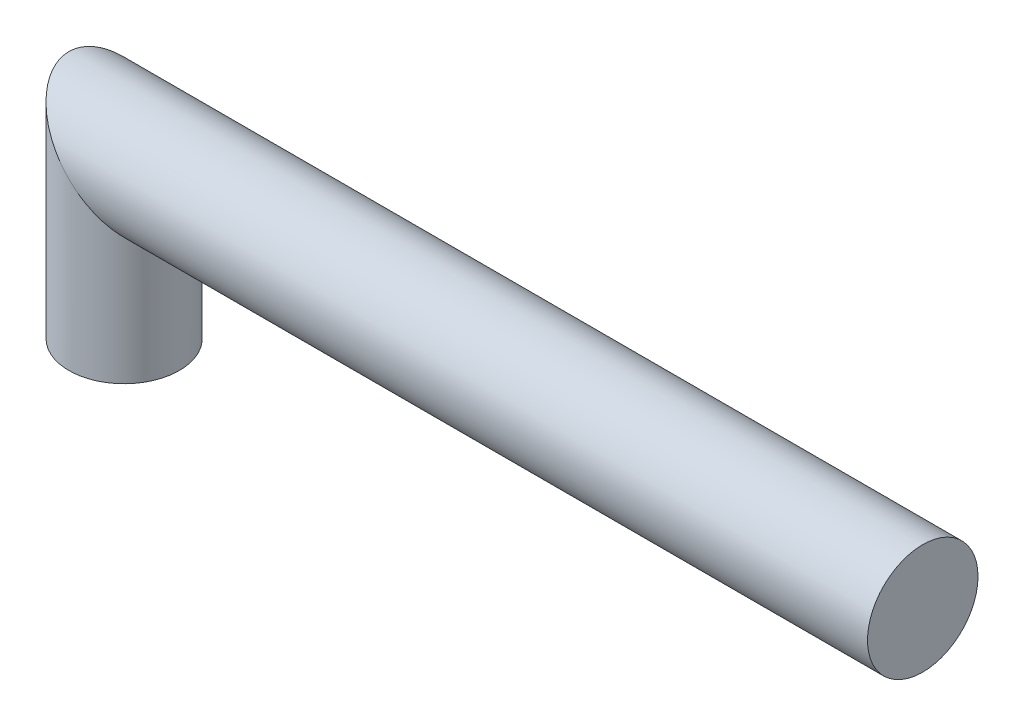
ISO-10303-21;
HEADER;
FILE_DESCRIPTION(('STEP AP214'),'2;1');
FILE_NAME('part.step','',(''),(''),'','','');
FILE_SCHEMA(('AUTOMOTIVE_DESIGN { 1 0 10303 214 1 1 1 1 }'));
ENDSEC;
DATA;
#1=APPLICATION_CONTEXT('core data for automotive mechanical design processes');
#2=APPLICATION_PROTOCOL_DEFINITION('international standard','automotive_design',2000,#1);
#3=PRODUCT_CONTEXT('',#1,'mechanical');
#4=PRODUCT('Part','Part','',(#3));
#5=PRODUCT_RELATED_PRODUCT_CATEGORY('part','',(#4));
#6=PRODUCT_DEFINITION_FORMATION('','',#4);
#7=PRODUCT_DEFINITION_CONTEXT('part definition',#1,'design');
#8=PRODUCT_DEFINITION('design','',#6,#7);
#9=PRODUCT_DEFINITION_SHAPE('','',#8);
#10=(LENGTH_UNIT() NAMED_UNIT(*) SI_UNIT(.MILLI.,.METRE.));
#11=(NAMED_UNIT(*) PLANE_ANGLE_UNIT() SI_UNIT($,.RADIAN.));
#12=(NAMED_UNIT(*) SI_UNIT($,.STERADIAN.) SOLID_ANGLE_UNIT());
#13=UNCERTAINTY_MEASURE_WITH_UNIT(LENGTH_MEASURE(1.E-05),#10,'distance_accuracy_value','');
#14=(GEOMETRIC_REPRESENTATION_CONTEXT(3) GLOBAL_UNCERTAINTY_ASSIGNED_CONTEXT((#13)) GLOBAL_UNIT_ASSIGNED_CONTEXT((#10,
#11,#12)) REPRESENTATION_CONTEXT('',''));
#15=CARTESIAN_POINT('',(0.,0.,0.));
#16=DIRECTION('',(0.,0.,1.));
#17=DIRECTION('',(1.,0.,0.));
#18=AXIS2_PLACEMENT_3D('',#15,#16,#17);
#19=CARTESIAN_POINT('',(-42.73,-30.,0.));
#20=DIRECTION('',(0.,1.,0.));
#21=DIRECTION('',(0.,0.,-1.));
#22=AXIS2_PLACEMENT_3D('',#19,#20,#21);
#23=PLANE('',#22);
#24=CARTESIAN_POINT('',(-42.73,-30.,0.));
#25=DIRECTION('',(0.,1.,0.));
#26=DIRECTION('',(0.,0.,-1.));
#27=AXIS2_PLACEMENT_3D('',#24,#25,#26);
#28=CIRCLE('',#27,10.);
#29=CARTESIAN_POINT('',(-42.73,-30.,-10.));
#30=VERTEX_POINT('',#29);
#31=EDGE_CURVE('E38',#30,#30,#28,.T.);
#32=ORIENTED_EDGE('',*,*,#31,.F.);
#33=EDGE_LOOP('',(#32));
#34=FACE_BOUND('',#33,.T.);
#35=ADVANCED_FACE('F35',(#34),#23,.F.);
#36=CARTESIAN_POINT('',(101.83,0.,0.));
#37=DIRECTION('',(1.,0.,0.));
#38=DIRECTION('',(0.,0.,-1.));
#39=AXIS2_PLACEMENT_3D('',#36,#37,#38);
#40=PLANE('',#39);
#41=CARTESIAN_POINT('',(101.83,0.,0.));
#42=DIRECTION('',(1.,0.,0.));
#43=DIRECTION('',(0.,0.,-1.));
#44=AXIS2_PLACEMENT_3D('',#41,#42,#43);
#45=CIRCLE('',#44,10.);
#46=CARTESIAN_POINT('',(101.83,0.,-10.));
#47=VERTEX_POINT('',#46);
#48=EDGE_CURVE('E42',#47,#47,#45,.T.);
#49=ORIENTED_EDGE('',*,*,#48,.T.);
#50=EDGE_LOOP('',(#49));
#51=FACE_BOUND('',#50,.T.);
#52=ADVANCED_FACE('F55',(#51),#40,.T.);
#53=CARTESIAN_POINT('',(-42.73,22.1,0.));
#54=DIRECTION('',(0.,-1.,0.));
#55=DIRECTION('',(1.,0.,0.));
#56=AXIS2_PLACEMENT_3D('',#53,#54,#55);
#57=CYLINDRICAL_SURFACE('',#56,10.);
#58=CARTESIAN_POINT('',(-42.73,0.,0.));
#59=DIRECTION('',(-0.707106781186547,-0.707106781186548,0.));
#60=DIRECTION('',(-0.707106781186548,0.707106781186547,0.));
#61=AXIS2_PLACEMENT_3D('',#58,#59,#60);
#62=ELLIPSE('',#61,14.1421356237309,10.);
#63=CARTESIAN_POINT('',(-52.73,9.99999999999998,0.));
#64=VERTEX_POINT('',#63);
#65=EDGE_CURVE('E10',#64,#64,#62,.T.);
#66=ORIENTED_EDGE('',*,*,#65,.T.);
#67=EDGE_LOOP('',(#66));
#68=FACE_BOUND('',#67,.T.);
#69=ORIENTED_EDGE('',*,*,#31,.T.);
#70=EDGE_LOOP('',(#69));
#71=FACE_BOUND('',#70,.T.);
#72=ADVANCED_FACE('F52',(#68,#71),#57,.T.);
#73=CARTESIAN_POINT('',(101.83,0.,0.));
#74=DIRECTION('',(-1.,0.,0.));
#75=DIRECTION('',(0.,-1.,0.));
#76=AXIS2_PLACEMENT_3D('',#73,#74,#75);
#77=CYLINDRICAL_SURFACE('',#76,10.);
#78=ORIENTED_EDGE('',*,*,#48,.F.);
#79=EDGE_LOOP('',(#78));
#80=FACE_BOUND('',#79,.T.);
#81=ORIENTED_EDGE('',*,*,#65,.F.);
#82=EDGE_LOOP('',(#81));
#83=FACE_BOUND('',#82,.T.);
#84=ADVANCED_FACE('F59',(#80,#83),#77,.T.);
#85=CLOSED_SHELL('',(#35,#52,#72,#84));
#86=MANIFOLD_SOLID_BREP('B2',#85);
#87=ADVANCED_BREP_SHAPE_REPRESENTATION('',(#18,#86),#14);
#88=SHAPE_DEFINITION_REPRESENTATION(#9,#87);
ENDSEC;
END-ISO-10303-21;
